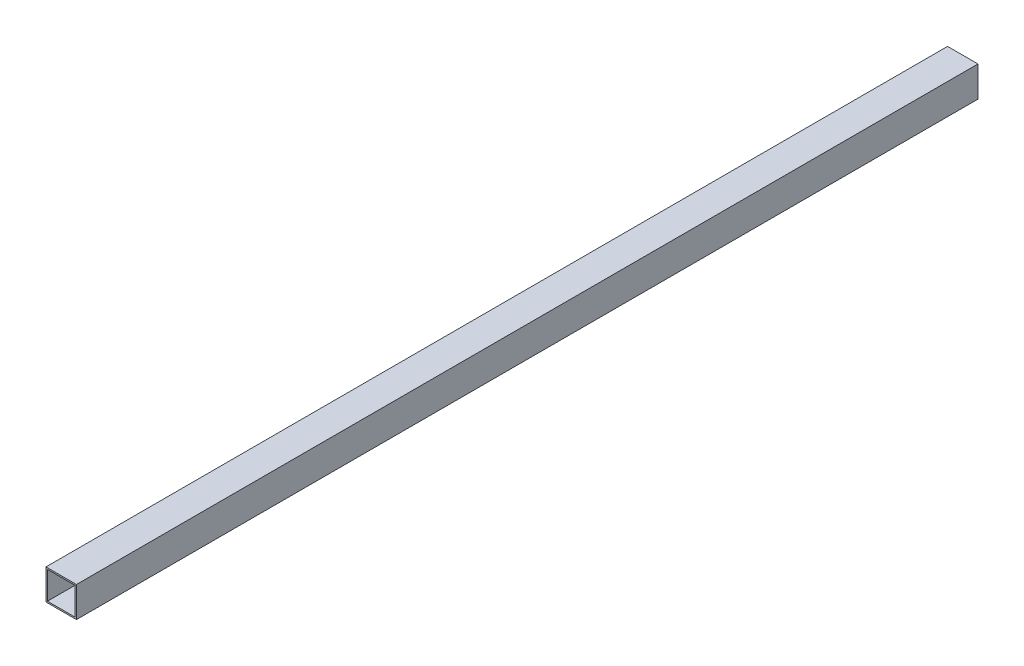
ISO-10303-21;
HEADER;
FILE_DESCRIPTION(('STEP AP214'),'2;1');
FILE_NAME('part.step','',(''),(''),'','','');
FILE_SCHEMA(('AUTOMOTIVE_DESIGN { 1 0 10303 214 1 1 1 1 }'));
ENDSEC;
DATA;
#1=APPLICATION_CONTEXT('core data for automotive mechanical design processes');
#2=APPLICATION_PROTOCOL_DEFINITION('international standard','automotive_design',2000,#1);
#3=PRODUCT_CONTEXT('',#1,'mechanical');
#4=PRODUCT('Part','Part','',(#3));
#5=PRODUCT_RELATED_PRODUCT_CATEGORY('part','',(#4));
#6=PRODUCT_DEFINITION_FORMATION('','',#4);
#7=PRODUCT_DEFINITION_CONTEXT('part definition',#1,'design');
#8=PRODUCT_DEFINITION('design','',#6,#7);
#9=PRODUCT_DEFINITION_SHAPE('','',#8);
#10=(LENGTH_UNIT() NAMED_UNIT(*) SI_UNIT(.MILLI.,.METRE.));
#11=(NAMED_UNIT(*) PLANE_ANGLE_UNIT() SI_UNIT($,.RADIAN.));
#12=(NAMED_UNIT(*) SI_UNIT($,.STERADIAN.) SOLID_ANGLE_UNIT());
#13=UNCERTAINTY_MEASURE_WITH_UNIT(LENGTH_MEASURE(1.E-05),#10,'distance_accuracy_value','');
#14=(GEOMETRIC_REPRESENTATION_CONTEXT(3) GLOBAL_UNCERTAINTY_ASSIGNED_CONTEXT((#13)) GLOBAL_UNIT_ASSIGNED_CONTEXT((#10,
#11,#12)) REPRESENTATION_CONTEXT('',''));
#15=CARTESIAN_POINT('',(0.,0.,0.));
#16=DIRECTION('',(0.,0.,1.));
#17=DIRECTION('',(1.,0.,0.));
#18=AXIS2_PLACEMENT_3D('',#15,#16,#17);
#19=CARTESIAN_POINT('',(0.,0.,740.));
#20=DIRECTION('',(0.,0.,-1.));
#21=DIRECTION('',(-1.,0.,0.));
#22=AXIS2_PLACEMENT_3D('',#19,#20,#21);
#23=PLANE('',#22);
#24=DIRECTION('',(0.,1.,0.));
#25=VECTOR('',#24,1.);
#26=CARTESIAN_POINT('',(12.5,-12.5,740.));
#27=LINE('',#26,#25);
#28=CARTESIAN_POINT('',(12.5,-12.5,740.));
#29=VERTEX_POINT('',#28);
#30=CARTESIAN_POINT('',(12.5,12.5,740.));
#31=VERTEX_POINT('',#30);
#32=EDGE_CURVE('E134',#29,#31,#27,.T.);
#33=ORIENTED_EDGE('',*,*,#32,.T.);
#34=DIRECTION('',(-1.,0.,0.));
#35=VECTOR('',#34,1.);
#36=CARTESIAN_POINT('',(-12.5,12.5,740.));
#37=LINE('',#36,#35);
#38=CARTESIAN_POINT('',(-12.5,12.5,740.));
#39=VERTEX_POINT('',#38);
#40=EDGE_CURVE('E137',#31,#39,#37,.T.);
#41=ORIENTED_EDGE('',*,*,#40,.T.);
#42=DIRECTION('',(0.,-1.,0.));
#43=VECTOR('',#42,1.);
#44=CARTESIAN_POINT('',(-12.5,-12.5,740.));
#45=LINE('',#44,#43);
#46=CARTESIAN_POINT('',(-12.5,-12.5,740.));
#47=VERTEX_POINT('',#46);
#48=EDGE_CURVE('E140',#39,#47,#45,.T.);
#49=ORIENTED_EDGE('',*,*,#48,.T.);
#50=DIRECTION('',(1.,0.,0.));
#51=VECTOR('',#50,1.);
#52=CARTESIAN_POINT('',(-12.5,-12.5,740.));
#53=LINE('',#52,#51);
#54=EDGE_CURVE('E142',#47,#29,#53,.T.);
#55=ORIENTED_EDGE('',*,*,#54,.T.);
#56=EDGE_LOOP('',(#33,#41,#49,#55));
#57=FACE_BOUND('',#56,.T.);
#58=DIRECTION('',(0.,-1.,0.));
#59=VECTOR('',#58,1.);
#60=CARTESIAN_POINT('',(-11.3,-11.3,740.));
#61=LINE('',#60,#59);
#62=CARTESIAN_POINT('',(-11.3,11.3,740.));
#63=VERTEX_POINT('',#62);
#64=CARTESIAN_POINT('',(-11.3,-11.3,740.));
#65=VERTEX_POINT('',#64);
#66=EDGE_CURVE('E98',#63,#65,#61,.T.);
#67=ORIENTED_EDGE('',*,*,#66,.F.);
#68=DIRECTION('',(-1.,0.,0.));
#69=VECTOR('',#68,1.);
#70=CARTESIAN_POINT('',(-11.3,11.3,740.));
#71=LINE('',#70,#69);
#72=CARTESIAN_POINT('',(11.3,11.3,740.));
#73=VERTEX_POINT('',#72);
#74=EDGE_CURVE('E120',#73,#63,#71,.T.);
#75=ORIENTED_EDGE('',*,*,#74,.F.);
#76=DIRECTION('',(0.,1.,0.));
#77=VECTOR('',#76,1.);
#78=CARTESIAN_POINT('',(11.3,-11.3,740.));
#79=LINE('',#78,#77);
#80=CARTESIAN_POINT('',(11.3,-11.3,740.));
#81=VERTEX_POINT('',#80);
#82=EDGE_CURVE('E118',#81,#73,#79,.T.);
#83=ORIENTED_EDGE('',*,*,#82,.F.);
#84=DIRECTION('',(1.,0.,0.));
#85=VECTOR('',#84,1.);
#86=CARTESIAN_POINT('',(-11.3,-11.3,740.));
#87=LINE('',#86,#85);
#88=EDGE_CURVE('E106',#65,#81,#87,.T.);
#89=ORIENTED_EDGE('',*,*,#88,.F.);
#90=EDGE_LOOP('',(#67,#75,#83,#89));
#91=FACE_BOUND('',#90,.T.);
#92=ADVANCED_FACE('F33',(#57,#91),#23,.F.);
#93=CARTESIAN_POINT('',(0.,0.,0.));
#94=DIRECTION('',(0.,0.,-1.));
#95=DIRECTION('',(-1.,0.,0.));
#96=AXIS2_PLACEMENT_3D('',#93,#94,#95);
#97=PLANE('',#96);
#98=DIRECTION('',(0.,1.,0.));
#99=VECTOR('',#98,1.);
#100=CARTESIAN_POINT('',(12.5,-12.5,0.));
#101=LINE('',#100,#99);
#102=CARTESIAN_POINT('',(12.5,-12.5,0.));
#103=VERTEX_POINT('',#102);
#104=CARTESIAN_POINT('',(12.5,12.5,0.));
#105=VERTEX_POINT('',#104);
#106=EDGE_CURVE('E114',#103,#105,#101,.T.);
#107=ORIENTED_EDGE('',*,*,#106,.F.);
#108=DIRECTION('',(1.,0.,0.));
#109=VECTOR('',#108,1.);
#110=CARTESIAN_POINT('',(-12.5,-12.5,0.));
#111=LINE('',#110,#109);
#112=CARTESIAN_POINT('',(-12.5,-12.5,0.));
#113=VERTEX_POINT('',#112);
#114=EDGE_CURVE('E138',#113,#103,#111,.T.);
#115=ORIENTED_EDGE('',*,*,#114,.F.);
#116=DIRECTION('',(0.,-1.,0.));
#117=VECTOR('',#116,1.);
#118=CARTESIAN_POINT('',(-12.5,-12.5,0.));
#119=LINE('',#118,#117);
#120=CARTESIAN_POINT('',(-12.5,12.5,0.));
#121=VERTEX_POINT('',#120);
#122=EDGE_CURVE('E149',#121,#113,#119,.T.);
#123=ORIENTED_EDGE('',*,*,#122,.F.);
#124=DIRECTION('',(-1.,0.,0.));
#125=VECTOR('',#124,1.);
#126=CARTESIAN_POINT('',(-12.5,12.5,0.));
#127=LINE('',#126,#125);
#128=EDGE_CURVE('E147',#105,#121,#127,.T.);
#129=ORIENTED_EDGE('',*,*,#128,.F.);
#130=EDGE_LOOP('',(#107,#115,#123,#129));
#131=FACE_BOUND('',#130,.T.);
#132=DIRECTION('',(-1.,0.,0.));
#133=VECTOR('',#132,1.);
#134=CARTESIAN_POINT('',(-11.3,11.3,0.));
#135=LINE('',#134,#133);
#136=CARTESIAN_POINT('',(11.3,11.3,0.));
#137=VERTEX_POINT('',#136);
#138=CARTESIAN_POINT('',(-11.3,11.3,0.));
#139=VERTEX_POINT('',#138);
#140=EDGE_CURVE('E107',#137,#139,#135,.T.);
#141=ORIENTED_EDGE('',*,*,#140,.T.);
#142=DIRECTION('',(0.,-1.,0.));
#143=VECTOR('',#142,1.);
#144=CARTESIAN_POINT('',(-11.3,-11.3,0.));
#145=LINE('',#144,#143);
#146=CARTESIAN_POINT('',(-11.3,-11.3,0.));
#147=VERTEX_POINT('',#146);
#148=EDGE_CURVE('E56',#139,#147,#145,.T.);
#149=ORIENTED_EDGE('',*,*,#148,.T.);
#150=DIRECTION('',(1.,0.,0.));
#151=VECTOR('',#150,1.);
#152=CARTESIAN_POINT('',(-11.3,-11.3,0.));
#153=LINE('',#152,#151);
#154=CARTESIAN_POINT('',(11.3,-11.3,0.));
#155=VERTEX_POINT('',#154);
#156=EDGE_CURVE('E113',#147,#155,#153,.T.);
#157=ORIENTED_EDGE('',*,*,#156,.T.);
#158=DIRECTION('',(0.,1.,0.));
#159=VECTOR('',#158,1.);
#160=CARTESIAN_POINT('',(11.3,-11.3,0.));
#161=LINE('',#160,#159);
#162=EDGE_CURVE('E126',#155,#137,#161,.T.);
#163=ORIENTED_EDGE('',*,*,#162,.T.);
#164=EDGE_LOOP('',(#141,#149,#157,#163));
#165=FACE_BOUND('',#164,.T.);
#166=ADVANCED_FACE('F167',(#131,#165),#97,.T.);
#167=CARTESIAN_POINT('',(12.5,-12.5,740.));
#168=DIRECTION('',(-1.,0.,0.));
#169=DIRECTION('',(0.,0.,1.));
#170=AXIS2_PLACEMENT_3D('',#167,#168,#169);
#171=PLANE('',#170);
#172=ORIENTED_EDGE('',*,*,#106,.T.);
#173=DIRECTION('',(0.,0.,-1.));
#174=VECTOR('',#173,1.);
#175=CARTESIAN_POINT('',(12.5,12.5,740.));
#176=LINE('',#175,#174);
#177=EDGE_CURVE('E11',#31,#105,#176,.T.);
#178=ORIENTED_EDGE('',*,*,#177,.F.);
#179=ORIENTED_EDGE('',*,*,#32,.F.);
#180=DIRECTION('',(0.,0.,-1.));
#181=VECTOR('',#180,1.);
#182=CARTESIAN_POINT('',(12.5,-12.5,740.));
#183=LINE('',#182,#181);
#184=EDGE_CURVE('E144',#29,#103,#183,.T.);
#185=ORIENTED_EDGE('',*,*,#184,.T.);
#186=EDGE_LOOP('',(#172,#178,#179,#185));
#187=FACE_BOUND('',#186,.T.);
#188=ADVANCED_FACE('F35',(#187),#171,.F.);
#189=CARTESIAN_POINT('',(-12.5,12.5,740.));
#190=DIRECTION('',(0.,-1.,0.));
#191=DIRECTION('',(0.,0.,-1.));
#192=AXIS2_PLACEMENT_3D('',#189,#190,#191);
#193=PLANE('',#192);
#194=ORIENTED_EDGE('',*,*,#128,.T.);
#195=DIRECTION('',(0.,0.,-1.));
#196=VECTOR('',#195,1.);
#197=CARTESIAN_POINT('',(-12.5,12.5,740.));
#198=LINE('',#197,#196);
#199=EDGE_CURVE('E41',#39,#121,#198,.T.);
#200=ORIENTED_EDGE('',*,*,#199,.F.);
#201=ORIENTED_EDGE('',*,*,#40,.F.);
#202=ORIENTED_EDGE('',*,*,#177,.T.);
#203=EDGE_LOOP('',(#194,#200,#201,#202));
#204=FACE_BOUND('',#203,.T.);
#205=ADVANCED_FACE('F177',(#204),#193,.F.);
#206=CARTESIAN_POINT('',(-12.5,-12.5,740.));
#207=DIRECTION('',(1.,0.,0.));
#208=DIRECTION('',(0.,0.,-1.));
#209=AXIS2_PLACEMENT_3D('',#206,#207,#208);
#210=PLANE('',#209);
#211=ORIENTED_EDGE('',*,*,#122,.T.);
#212=DIRECTION('',(0.,0.,-1.));
#213=VECTOR('',#212,1.);
#214=CARTESIAN_POINT('',(-12.5,-12.5,740.));
#215=LINE('',#214,#213);
#216=EDGE_CURVE('E154',#47,#113,#215,.T.);
#217=ORIENTED_EDGE('',*,*,#216,.F.);
#218=ORIENTED_EDGE('',*,*,#48,.F.);
#219=ORIENTED_EDGE('',*,*,#199,.T.);
#220=EDGE_LOOP('',(#211,#217,#218,#219));
#221=FACE_BOUND('',#220,.T.);
#222=ADVANCED_FACE('F161',(#221),#210,.F.);
#223=CARTESIAN_POINT('',(-12.5,-12.5,740.));
#224=DIRECTION('',(0.,1.,0.));
#225=DIRECTION('',(0.,0.,1.));
#226=AXIS2_PLACEMENT_3D('',#223,#224,#225);
#227=PLANE('',#226);
#228=ORIENTED_EDGE('',*,*,#114,.T.);
#229=ORIENTED_EDGE('',*,*,#184,.F.);
#230=ORIENTED_EDGE('',*,*,#54,.F.);
#231=ORIENTED_EDGE('',*,*,#216,.T.);
#232=EDGE_LOOP('',(#228,#229,#230,#231));
#233=FACE_BOUND('',#232,.T.);
#234=ADVANCED_FACE('F171',(#233),#227,.F.);
#235=CARTESIAN_POINT('',(-11.3,-11.3,740.));
#236=DIRECTION('',(1.,0.,0.));
#237=DIRECTION('',(0.,0.,-1.));
#238=AXIS2_PLACEMENT_3D('',#235,#236,#237);
#239=PLANE('',#238);
#240=ORIENTED_EDGE('',*,*,#148,.F.);
#241=DIRECTION('',(0.,0.,-1.));
#242=VECTOR('',#241,1.);
#243=CARTESIAN_POINT('',(-11.3,11.3,740.));
#244=LINE('',#243,#242);
#245=EDGE_CURVE('E102',#63,#139,#244,.T.);
#246=ORIENTED_EDGE('',*,*,#245,.F.);
#247=ORIENTED_EDGE('',*,*,#66,.T.);
#248=DIRECTION('',(0.,0.,-1.));
#249=VECTOR('',#248,1.);
#250=CARTESIAN_POINT('',(-11.3,-11.3,740.));
#251=LINE('',#250,#249);
#252=EDGE_CURVE('E101',#65,#147,#251,.T.);
#253=ORIENTED_EDGE('',*,*,#252,.T.);
#254=EDGE_LOOP('',(#240,#246,#247,#253));
#255=FACE_BOUND('',#254,.T.);
#256=ADVANCED_FACE('F100',(#255),#239,.T.);
#257=CARTESIAN_POINT('',(-11.3,-11.3,740.));
#258=DIRECTION('',(0.,1.,0.));
#259=DIRECTION('',(0.,0.,1.));
#260=AXIS2_PLACEMENT_3D('',#257,#258,#259);
#261=PLANE('',#260);
#262=ORIENTED_EDGE('',*,*,#156,.F.);
#263=ORIENTED_EDGE('',*,*,#252,.F.);
#264=ORIENTED_EDGE('',*,*,#88,.T.);
#265=DIRECTION('',(0.,0.,-1.));
#266=VECTOR('',#265,1.);
#267=CARTESIAN_POINT('',(11.3,-11.3,740.));
#268=LINE('',#267,#266);
#269=EDGE_CURVE('E115',#81,#155,#268,.T.);
#270=ORIENTED_EDGE('',*,*,#269,.T.);
#271=EDGE_LOOP('',(#262,#263,#264,#270));
#272=FACE_BOUND('',#271,.T.);
#273=ADVANCED_FACE('F110',(#272),#261,.T.);
#274=CARTESIAN_POINT('',(11.3,-11.3,740.));
#275=DIRECTION('',(-1.,0.,0.));
#276=DIRECTION('',(0.,0.,1.));
#277=AXIS2_PLACEMENT_3D('',#274,#275,#276);
#278=PLANE('',#277);
#279=ORIENTED_EDGE('',*,*,#162,.F.);
#280=ORIENTED_EDGE('',*,*,#269,.F.);
#281=ORIENTED_EDGE('',*,*,#82,.T.);
#282=DIRECTION('',(0.,0.,-1.));
#283=VECTOR('',#282,1.);
#284=CARTESIAN_POINT('',(11.3,11.3,740.));
#285=LINE('',#284,#283);
#286=EDGE_CURVE('E48',#73,#137,#285,.T.);
#287=ORIENTED_EDGE('',*,*,#286,.T.);
#288=EDGE_LOOP('',(#279,#280,#281,#287));
#289=FACE_BOUND('',#288,.T.);
#290=ADVANCED_FACE('F200',(#289),#278,.T.);
#291=CARTESIAN_POINT('',(-11.3,11.3,740.));
#292=DIRECTION('',(0.,-1.,0.));
#293=DIRECTION('',(0.,0.,-1.));
#294=AXIS2_PLACEMENT_3D('',#291,#292,#293);
#295=PLANE('',#294);
#296=ORIENTED_EDGE('',*,*,#140,.F.);
#297=ORIENTED_EDGE('',*,*,#286,.F.);
#298=ORIENTED_EDGE('',*,*,#74,.T.);
#299=ORIENTED_EDGE('',*,*,#245,.T.);
#300=EDGE_LOOP('',(#296,#297,#298,#299));
#301=FACE_BOUND('',#300,.T.);
#302=ADVANCED_FACE('F204',(#301),#295,.T.);
#303=CLOSED_SHELL('',(#92,#166,#188,#205,#222,#234,#256,#273,#290,#302));
#304=MANIFOLD_SOLID_BREP('B2',#303);
#305=ADVANCED_BREP_SHAPE_REPRESENTATION('',(#18,#304),#14);
#306=SHAPE_DEFINITION_REPRESENTATION(#9,#305);
ENDSEC;
END-ISO-10303-21;
